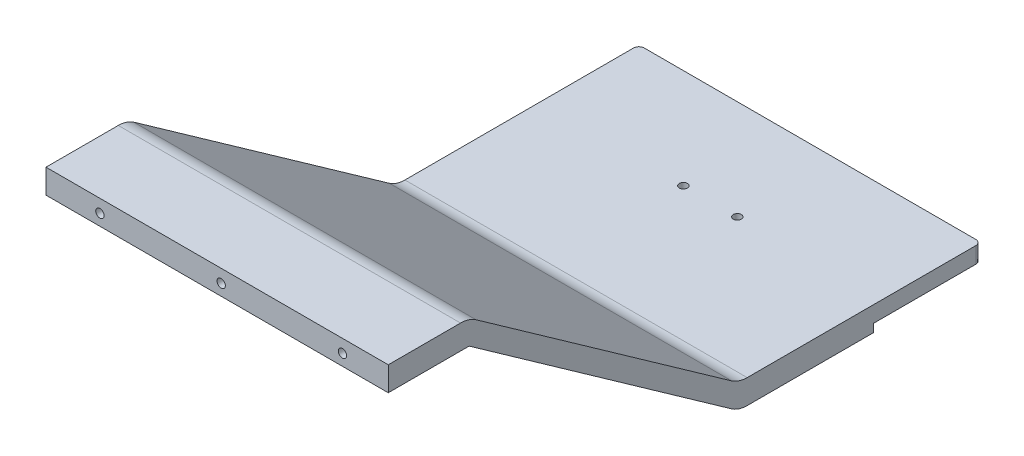
ISO-10303-21;
HEADER;
FILE_DESCRIPTION(('STEP AP214'),'2;1');
FILE_NAME('part.step','',(''),(''),'','','');
FILE_SCHEMA(('AUTOMOTIVE_DESIGN { 1 0 10303 214 1 1 1 1 }'));
ENDSEC;
DATA;
#1=APPLICATION_CONTEXT('core data for automotive mechanical design processes');
#2=APPLICATION_PROTOCOL_DEFINITION('international standard','automotive_design',2000,#1);
#3=PRODUCT_CONTEXT('',#1,'mechanical');
#4=PRODUCT('Part','Part','',(#3));
#5=PRODUCT_RELATED_PRODUCT_CATEGORY('part','',(#4));
#6=PRODUCT_DEFINITION_FORMATION('','',#4);
#7=PRODUCT_DEFINITION_CONTEXT('part definition',#1,'design');
#8=PRODUCT_DEFINITION('design','',#6,#7);
#9=PRODUCT_DEFINITION_SHAPE('','',#8);
#10=(LENGTH_UNIT() NAMED_UNIT(*) SI_UNIT(.MILLI.,.METRE.));
#11=(NAMED_UNIT(*) PLANE_ANGLE_UNIT() SI_UNIT($,.RADIAN.));
#12=(NAMED_UNIT(*) SI_UNIT($,.STERADIAN.) SOLID_ANGLE_UNIT());
#13=UNCERTAINTY_MEASURE_WITH_UNIT(LENGTH_MEASURE(1.E-05),#10,'distance_accuracy_value','');
#14=(GEOMETRIC_REPRESENTATION_CONTEXT(3) GLOBAL_UNCERTAINTY_ASSIGNED_CONTEXT((#13)) GLOBAL_UNIT_ASSIGNED_CONTEXT((#10,
#11,#12)) REPRESENTATION_CONTEXT('',''));
#15=CARTESIAN_POINT('',(0.,0.,0.));
#16=DIRECTION('',(0.,0.,1.));
#17=DIRECTION('',(1.,0.,0.));
#18=AXIS2_PLACEMENT_3D('',#15,#16,#17);
#19=CARTESIAN_POINT('',(206.,70.,-50.));
#20=DIRECTION('',(0.,0.,1.));
#21=DIRECTION('',(1.,0.,0.));
#22=AXIS2_PLACEMENT_3D('',#19,#20,#21);
#23=PLANE('',#22);
#24=DIRECTION('',(0.,1.,0.));
#25=VECTOR('',#24,1.);
#26=CARTESIAN_POINT('',(79.,70.,-50.));
#27=LINE('',#26,#25);
#28=CARTESIAN_POINT('',(79.,70.,-50.));
#29=VERTEX_POINT('',#28);
#30=CARTESIAN_POINT('',(79.,73.,-50.));
#31=VERTEX_POINT('',#30);
#32=EDGE_CURVE('E190',#29,#31,#27,.T.);
#33=ORIENTED_EDGE('',*,*,#32,.T.);
#34=DIRECTION('',(-1.,0.,0.));
#35=VECTOR('',#34,1.);
#36=CARTESIAN_POINT('',(206.,73.,-50.));
#37=LINE('',#36,#35);
#38=CARTESIAN_POINT('',(206.,73.,-50.));
#39=VERTEX_POINT('',#38);
#40=EDGE_CURVE('E252',#39,#31,#37,.T.);
#41=ORIENTED_EDGE('',*,*,#40,.F.);
#42=DIRECTION('',(0.,1.,0.));
#43=VECTOR('',#42,1.);
#44=CARTESIAN_POINT('',(206.,70.,-50.));
#45=LINE('',#44,#43);
#46=CARTESIAN_POINT('',(206.,70.,-50.));
#47=VERTEX_POINT('',#46);
#48=EDGE_CURVE('E197',#47,#39,#45,.T.);
#49=ORIENTED_EDGE('',*,*,#48,.F.);
#50=DIRECTION('',(-1.,0.,0.));
#51=VECTOR('',#50,1.);
#52=CARTESIAN_POINT('',(206.,70.,-50.));
#53=LINE('',#52,#51);
#54=EDGE_CURVE('E211',#47,#29,#53,.T.);
#55=ORIENTED_EDGE('',*,*,#54,.T.);
#56=EDGE_LOOP('',(#33,#41,#49,#55));
#57=FACE_BOUND('',#56,.T.);
#58=ADVANCED_FACE('F57',(#57),#23,.F.);
#59=CARTESIAN_POINT('',(206.,73.,-50.));
#60=DIRECTION('',(0.,1.,0.));
#61=DIRECTION('',(0.,0.,1.));
#62=AXIS2_PLACEMENT_3D('',#59,#60,#61);
#63=PLANE('',#62);
#64=CARTESIAN_POINT('',(132.5,73.,-53.));
#65=DIRECTION('',(0.,-1.,0.));
#66=DIRECTION('',(0.,0.,-1.));
#67=AXIS2_PLACEMENT_3D('',#64,#65,#66);
#68=CIRCLE('',#67,1.5);
#69=CARTESIAN_POINT('',(132.5,73.,-54.5));
#70=VERTEX_POINT('',#69);
#71=EDGE_CURVE('E277',#70,#70,#68,.T.);
#72=ORIENTED_EDGE('',*,*,#71,.F.);
#73=EDGE_LOOP('',(#72));
#74=FACE_BOUND('',#73,.T.);
#75=CARTESIAN_POINT('',(152.5,73.,-53.));
#76=DIRECTION('',(0.,-1.,0.));
#77=DIRECTION('',(0.,0.,-1.));
#78=AXIS2_PLACEMENT_3D('',#75,#76,#77);
#79=CIRCLE('',#78,1.5);
#80=CARTESIAN_POINT('',(152.5,73.,-54.5));
#81=VERTEX_POINT('',#80);
#82=EDGE_CURVE('E557',#81,#81,#79,.T.);
#83=ORIENTED_EDGE('',*,*,#82,.F.);
#84=EDGE_LOOP('',(#83));
#85=FACE_BOUND('',#84,.T.);
#86=DIRECTION('',(-1.,0.,0.));
#87=VECTOR('',#86,1.);
#88=CARTESIAN_POINT('',(206.,73.,-90.));
#89=LINE('',#88,#87);
#90=CARTESIAN_POINT('',(204.,73.,-90.));
#91=VERTEX_POINT('',#90);
#92=CARTESIAN_POINT('',(81.,73.,-90.));
#93=VERTEX_POINT('',#92);
#94=EDGE_CURVE('E247',#91,#93,#89,.T.);
#95=ORIENTED_EDGE('',*,*,#94,.F.);
#96=CARTESIAN_POINT('',(204.,73.,-88.));
#97=DIRECTION('',(0.,1.,0.));
#98=DIRECTION('',(0.,0.,1.));
#99=AXIS2_PLACEMENT_3D('',#96,#97,#98);
#100=CIRCLE('',#99,2.);
#101=CARTESIAN_POINT('',(206.,73.,-88.));
#102=VERTEX_POINT('',#101);
#103=EDGE_CURVE('E270',#91,#102,#100,.F.);
#104=ORIENTED_EDGE('',*,*,#103,.T.);
#105=DIRECTION('',(0.,0.,-1.));
#106=VECTOR('',#105,1.);
#107=CARTESIAN_POINT('',(206.,73.,-50.));
#108=LINE('',#107,#106);
#109=EDGE_CURVE('E199',#39,#102,#108,.T.);
#110=ORIENTED_EDGE('',*,*,#109,.F.);
#111=ORIENTED_EDGE('',*,*,#40,.T.);
#112=DIRECTION('',(0.,0.,-1.));
#113=VECTOR('',#112,1.);
#114=CARTESIAN_POINT('',(79.,73.,-50.));
#115=LINE('',#114,#113);
#116=CARTESIAN_POINT('',(79.,73.,-88.));
#117=VERTEX_POINT('',#116);
#118=EDGE_CURVE('E188',#31,#117,#115,.T.);
#119=ORIENTED_EDGE('',*,*,#118,.T.);
#120=CARTESIAN_POINT('',(81.,73.,-88.));
#121=DIRECTION('',(0.,1.,0.));
#122=DIRECTION('',(0.,0.,1.));
#123=AXIS2_PLACEMENT_3D('',#120,#121,#122);
#124=CIRCLE('',#123,2.);
#125=EDGE_CURVE('E269',#117,#93,#124,.F.);
#126=ORIENTED_EDGE('',*,*,#125,.T.);
#127=EDGE_LOOP('',(#95,#104,#110,#111,#119,#126));
#128=FACE_BOUND('',#127,.T.);
#129=ADVANCED_FACE('F325',(#74,#85,#128),#63,.F.);
#130=CARTESIAN_POINT('',(206.,73.,-90.));
#131=DIRECTION('',(0.,0.,1.));
#132=DIRECTION('',(1.,0.,0.));
#133=AXIS2_PLACEMENT_3D('',#130,#131,#132);
#134=PLANE('',#133);
#135=DIRECTION('',(-1.,0.,0.));
#136=VECTOR('',#135,1.);
#137=CARTESIAN_POINT('',(206.,79.,-90.));
#138=LINE('',#137,#136);
#139=CARTESIAN_POINT('',(204.,79.,-90.));
#140=VERTEX_POINT('',#139);
#141=CARTESIAN_POINT('',(81.,79.,-90.));
#142=VERTEX_POINT('',#141);
#143=EDGE_CURVE('E244',#140,#142,#138,.T.);
#144=ORIENTED_EDGE('',*,*,#143,.F.);
#145=DIRECTION('',(0.,1.,0.));
#146=VECTOR('',#145,1.);
#147=CARTESIAN_POINT('',(204.,73.,-90.));
#148=LINE('',#147,#146);
#149=EDGE_CURVE('E264',#140,#91,#148,.F.);
#150=ORIENTED_EDGE('',*,*,#149,.T.);
#151=ORIENTED_EDGE('',*,*,#94,.T.);
#152=DIRECTION('',(0.,1.,0.));
#153=VECTOR('',#152,1.);
#154=CARTESIAN_POINT('',(81.,73.,-90.));
#155=LINE('',#154,#153);
#156=EDGE_CURVE('E262',#93,#142,#155,.T.);
#157=ORIENTED_EDGE('',*,*,#156,.T.);
#158=EDGE_LOOP('',(#144,#150,#151,#157));
#159=FACE_BOUND('',#158,.T.);
#160=ADVANCED_FACE('F357',(#159),#134,.F.);
#161=CARTESIAN_POINT('',(206.,79.,-90.));
#162=DIRECTION('',(0.,-1.,0.));
#163=DIRECTION('',(0.,0.,-1.));
#164=AXIS2_PLACEMENT_3D('',#161,#162,#163);
#165=PLANE('',#164);
#166=CARTESIAN_POINT('',(132.5,79.,-53.));
#167=DIRECTION('',(0.,-1.,0.));
#168=DIRECTION('',(0.,0.,-1.));
#169=AXIS2_PLACEMENT_3D('',#166,#167,#168);
#170=CIRCLE('',#169,1.5);
#171=CARTESIAN_POINT('',(132.5,79.,-54.5));
#172=VERTEX_POINT('',#171);
#173=EDGE_CURVE('E273',#172,#172,#170,.T.);
#174=ORIENTED_EDGE('',*,*,#173,.T.);
#175=EDGE_LOOP('',(#174));
#176=FACE_BOUND('',#175,.T.);
#177=CARTESIAN_POINT('',(152.5,79.,-53.));
#178=DIRECTION('',(0.,-1.,0.));
#179=DIRECTION('',(0.,0.,-1.));
#180=AXIS2_PLACEMENT_3D('',#177,#178,#179);
#181=CIRCLE('',#180,1.5);
#182=CARTESIAN_POINT('',(152.5,79.,-54.5));
#183=VERTEX_POINT('',#182);
#184=EDGE_CURVE('E275',#183,#183,#181,.T.);
#185=ORIENTED_EDGE('',*,*,#184,.T.);
#186=EDGE_LOOP('',(#185));
#187=FACE_BOUND('',#186,.T.);
#188=DIRECTION('',(0.,0.,1.));
#189=VECTOR('',#188,1.);
#190=CARTESIAN_POINT('',(206.,79.,-90.));
#191=LINE('',#190,#189);
#192=CARTESIAN_POINT('',(206.,79.,-88.));
#193=VERTEX_POINT('',#192);
#194=CARTESIAN_POINT('',(206.,79.,-3.17837245195783));
#195=VERTEX_POINT('',#194);
#196=EDGE_CURVE('E205',#193,#195,#191,.T.);
#197=ORIENTED_EDGE('',*,*,#196,.F.);
#198=CARTESIAN_POINT('',(204.,79.,-88.));
#199=DIRECTION('',(0.,-1.,0.));
#200=DIRECTION('',(0.,0.,-1.));
#201=AXIS2_PLACEMENT_3D('',#198,#199,#200);
#202=CIRCLE('',#201,2.);
#203=EDGE_CURVE('E256',#193,#140,#202,.F.);
#204=ORIENTED_EDGE('',*,*,#203,.T.);
#205=ORIENTED_EDGE('',*,*,#143,.T.);
#206=CARTESIAN_POINT('',(81.,79.,-88.));
#207=DIRECTION('',(0.,-1.,0.));
#208=DIRECTION('',(0.,0.,-1.));
#209=AXIS2_PLACEMENT_3D('',#206,#207,#208);
#210=CIRCLE('',#209,2.);
#211=CARTESIAN_POINT('',(79.,79.,-88.));
#212=VERTEX_POINT('',#211);
#213=EDGE_CURVE('E259',#142,#212,#210,.F.);
#214=ORIENTED_EDGE('',*,*,#213,.T.);
#215=DIRECTION('',(0.,0.,1.));
#216=VECTOR('',#215,1.);
#217=CARTESIAN_POINT('',(79.,79.,-90.));
#218=LINE('',#217,#216);
#219=CARTESIAN_POINT('',(79.,79.,-3.17837245195783));
#220=VERTEX_POINT('',#219);
#221=EDGE_CURVE('E218',#212,#220,#218,.T.);
#222=ORIENTED_EDGE('',*,*,#221,.T.);
#223=DIRECTION('',(-1.,0.,0.));
#224=VECTOR('',#223,1.);
#225=CARTESIAN_POINT('',(206.,79.,-3.17837245195783));
#226=LINE('',#225,#224);
#227=EDGE_CURVE('E245',#195,#220,#226,.T.);
#228=ORIENTED_EDGE('',*,*,#227,.F.);
#229=EDGE_LOOP('',(#197,#204,#205,#214,#222,#228));
#230=FACE_BOUND('',#229,.T.);
#231=ADVANCED_FACE('F331',(#176,#187,#230),#165,.F.);
#232=CARTESIAN_POINT('',(206.,89.,-3.17837245195783));
#233=DIRECTION('',(-1.,0.,0.));
#234=DIRECTION('',(0.,0.,1.));
#235=AXIS2_PLACEMENT_3D('',#232,#233,#234);
#236=CYLINDRICAL_SURFACE('',#235,10.);
#237=CARTESIAN_POINT('',(79.,89.,-3.17837245195783));
#238=DIRECTION('',(-1.,0.,0.));
#239=DIRECTION('',(0.,0.,-1.));
#240=AXIS2_PLACEMENT_3D('',#237,#238,#239);
#241=CIRCLE('',#240,10.);
#242=CARTESIAN_POINT('',(79.,80.8350341907227,2.59513023993843));
#243=VERTEX_POINT('',#242);
#244=EDGE_CURVE('E216',#220,#243,#241,.T.);
#245=ORIENTED_EDGE('',*,*,#244,.T.);
#246=DIRECTION('',(-1.,0.,0.));
#247=VECTOR('',#246,1.);
#248=CARTESIAN_POINT('',(206.,80.8350341907227,2.59513023993843));
#249=LINE('',#248,#247);
#250=CARTESIAN_POINT('',(206.,80.8350341907227,2.59513023993843));
#251=VERTEX_POINT('',#250);
#252=EDGE_CURVE('E237',#251,#243,#249,.T.);
#253=ORIENTED_EDGE('',*,*,#252,.F.);
#254=CARTESIAN_POINT('',(206.,89.,-3.17837245195783));
#255=DIRECTION('',(-1.,0.,0.));
#256=DIRECTION('',(0.,0.,-1.));
#257=AXIS2_PLACEMENT_3D('',#254,#255,#256);
#258=CIRCLE('',#257,10.);
#259=EDGE_CURVE('E202',#195,#251,#258,.T.);
#260=ORIENTED_EDGE('',*,*,#259,.F.);
#261=ORIENTED_EDGE('',*,*,#227,.T.);
#262=EDGE_LOOP('',(#245,#253,#260,#261));
#263=FACE_BOUND('',#262,.T.);
#264=ADVANCED_FACE('F339',(#263),#236,.F.);
#265=CARTESIAN_POINT('',(206.,80.8350341907227,2.59513023993843));
#266=DIRECTION('',(0.,-0.816496580927727,0.577350269189625));
#267=DIRECTION('',(0.,-0.577350269189625,-0.816496580927727));
#268=AXIS2_PLACEMENT_3D('',#265,#266,#267);
#269=PLANE('',#268);
#270=DIRECTION('',(0.,0.577350269189625,0.816496580927726));
#271=VECTOR('',#270,1.);
#272=CARTESIAN_POINT('',(79.,80.8350341907227,2.59513023993843));
#273=LINE('',#272,#271);
#274=CARTESIAN_POINT('',(79.,147.875643927932,97.4048697600616));
#275=VERTEX_POINT('',#274);
#276=EDGE_CURVE('E221',#243,#275,#273,.T.);
#277=ORIENTED_EDGE('',*,*,#276,.T.);
#278=DIRECTION('',(-1.,0.,0.));
#279=VECTOR('',#278,1.);
#280=CARTESIAN_POINT('',(206.,147.875643927932,97.4048697600616));
#281=LINE('',#280,#279);
#282=CARTESIAN_POINT('',(206.,147.875643927932,97.4048697600616));
#283=VERTEX_POINT('',#282);
#284=EDGE_CURVE('E61',#275,#283,#281,.F.);
#285=ORIENTED_EDGE('',*,*,#284,.T.);
#286=DIRECTION('',(0.,0.577350269189625,0.816496580927726));
#287=VECTOR('',#286,1.);
#288=CARTESIAN_POINT('',(206.,80.8350341907227,2.59513023993843));
#289=LINE('',#288,#287);
#290=EDGE_CURVE('E210',#251,#283,#289,.T.);
#291=ORIENTED_EDGE('',*,*,#290,.F.);
#292=ORIENTED_EDGE('',*,*,#252,.T.);
#293=EDGE_LOOP('',(#277,#285,#291,#292));
#294=FACE_BOUND('',#293,.T.);
#295=ADVANCED_FACE('F374',(#294),#269,.F.);
#296=CARTESIAN_POINT('',(206.,140.710678118655,100.));
#297=DIRECTION('',(0.,0.816496580927726,-0.577350269189625));
#298=DIRECTION('',(0.,0.577350269189625,0.816496580927727));
#299=AXIS2_PLACEMENT_3D('',#296,#297,#298);
#300=PLANE('',#299);
#301=DIRECTION('',(0.,-0.577350269189625,-0.816496580927727));
#302=VECTOR('',#301,1.);
#303=CARTESIAN_POINT('',(79.,140.710678118655,100.));
#304=LINE('',#303,#302);
#305=CARTESIAN_POINT('',(79.,140.710678118655,100.));
#306=VERTEX_POINT('',#305);
#307=CARTESIAN_POINT('',(79.,71.8350341907228,2.59513023993842));
#308=VERTEX_POINT('',#307);
#309=EDGE_CURVE('E223',#306,#308,#304,.T.);
#310=ORIENTED_EDGE('',*,*,#309,.T.);
#311=DIRECTION('',(-1.,0.,0.));
#312=VECTOR('',#311,1.);
#313=CARTESIAN_POINT('',(206.,71.8350341907228,2.59513023993842));
#314=LINE('',#313,#312);
#315=CARTESIAN_POINT('',(206.,71.8350341907228,2.59513023993842));
#316=VERTEX_POINT('',#315);
#317=EDGE_CURVE('E234',#316,#308,#314,.T.);
#318=ORIENTED_EDGE('',*,*,#317,.F.);
#319=DIRECTION('',(0.,-0.577350269189625,-0.816496580927727));
#320=VECTOR('',#319,1.);
#321=CARTESIAN_POINT('',(206.,140.710678118655,100.));
#322=LINE('',#321,#320);
#323=CARTESIAN_POINT('',(206.,140.710678118655,100.));
#324=VERTEX_POINT('',#323);
#325=EDGE_CURVE('E209',#324,#316,#322,.T.);
#326=ORIENTED_EDGE('',*,*,#325,.F.);
#327=DIRECTION('',(-1.,0.,0.));
#328=VECTOR('',#327,1.);
#329=CARTESIAN_POINT('',(206.,140.710678118655,100.));
#330=LINE('',#329,#328);
#331=EDGE_CURVE('E240',#324,#306,#330,.T.);
#332=ORIENTED_EDGE('',*,*,#331,.T.);
#333=EDGE_LOOP('',(#310,#318,#326,#332));
#334=FACE_BOUND('',#333,.T.);
#335=ADVANCED_FACE('F304',(#334),#300,.F.);
#336=CARTESIAN_POINT('',(206.,80.,-3.17837245195782));
#337=DIRECTION('',(-1.,0.,0.));
#338=DIRECTION('',(0.,0.,1.));
#339=AXIS2_PLACEMENT_3D('',#336,#337,#338);
#340=CYLINDRICAL_SURFACE('',#339,9.99999999999999);
#341=CARTESIAN_POINT('',(79.,80.,-3.17837245195782));
#342=DIRECTION('',(1.,0.,0.));
#343=DIRECTION('',(0.,0.,-1.));
#344=AXIS2_PLACEMENT_3D('',#341,#342,#343);
#345=CIRCLE('',#344,9.99999999999999);
#346=CARTESIAN_POINT('',(79.,70.,-3.17837245195782));
#347=VERTEX_POINT('',#346);
#348=EDGE_CURVE('E228',#308,#347,#345,.T.);
#349=ORIENTED_EDGE('',*,*,#348,.T.);
#350=DIRECTION('',(-1.,0.,0.));
#351=VECTOR('',#350,1.);
#352=CARTESIAN_POINT('',(206.,70.,-3.17837245195782));
#353=LINE('',#352,#351);
#354=CARTESIAN_POINT('',(206.,70.,-3.17837245195782));
#355=VERTEX_POINT('',#354);
#356=EDGE_CURVE('E233',#355,#347,#353,.T.);
#357=ORIENTED_EDGE('',*,*,#356,.F.);
#358=CARTESIAN_POINT('',(206.,80.,-3.17837245195782));
#359=DIRECTION('',(1.,0.,0.));
#360=DIRECTION('',(0.,0.,-1.));
#361=AXIS2_PLACEMENT_3D('',#358,#359,#360);
#362=CIRCLE('',#361,9.99999999999999);
#363=EDGE_CURVE('E212',#316,#355,#362,.T.);
#364=ORIENTED_EDGE('',*,*,#363,.F.);
#365=ORIENTED_EDGE('',*,*,#317,.T.);
#366=EDGE_LOOP('',(#349,#357,#364,#365));
#367=FACE_BOUND('',#366,.T.);
#368=ADVANCED_FACE('F311',(#367),#340,.T.);
#369=CARTESIAN_POINT('',(206.,70.,-3.17837245195782));
#370=DIRECTION('',(0.,1.,0.));
#371=DIRECTION('',(0.,0.,1.));
#372=AXIS2_PLACEMENT_3D('',#369,#370,#371);
#373=PLANE('',#372);
#374=DIRECTION('',(0.,0.,-1.));
#375=VECTOR('',#374,1.);
#376=CARTESIAN_POINT('',(79.,70.,-3.17837245195782));
#377=LINE('',#376,#375);
#378=EDGE_CURVE('E196',#347,#29,#377,.T.);
#379=ORIENTED_EDGE('',*,*,#378,.T.);
#380=ORIENTED_EDGE('',*,*,#54,.F.);
#381=DIRECTION('',(0.,0.,-1.));
#382=VECTOR('',#381,1.);
#383=CARTESIAN_POINT('',(206.,70.,-3.17837245195782));
#384=LINE('',#383,#382);
#385=EDGE_CURVE('E215',#355,#47,#384,.T.);
#386=ORIENTED_EDGE('',*,*,#385,.F.);
#387=ORIENTED_EDGE('',*,*,#356,.T.);
#388=EDGE_LOOP('',(#379,#380,#386,#387));
#389=FACE_BOUND('',#388,.T.);
#390=ADVANCED_FACE('F314',(#389),#373,.F.);
#391=CARTESIAN_POINT('',(206.,89.,-3.17837245195783));
#392=DIRECTION('',(1.,0.,0.));
#393=DIRECTION('',(0.,0.,-1.));
#394=AXIS2_PLACEMENT_3D('',#391,#392,#393);
#395=PLANE('',#394);
#396=ORIENTED_EDGE('',*,*,#290,.T.);
#397=CARTESIAN_POINT('',(206.,139.710678118655,103.178372451958));
#398=DIRECTION('',(1.,0.,0.));
#399=DIRECTION('',(0.,0.,-1.));
#400=AXIS2_PLACEMENT_3D('',#397,#398,#399);
#401=CIRCLE('',#400,10.);
#402=CARTESIAN_POINT('',(206.,149.710678118655,103.178372451958));
#403=VERTEX_POINT('',#402);
#404=EDGE_CURVE('E12',#283,#403,#401,.T.);
#405=ORIENTED_EDGE('',*,*,#404,.T.);
#406=DIRECTION('',(0.,0.,-1.));
#407=VECTOR('',#406,1.);
#408=CARTESIAN_POINT('',(206.,149.710678118655,130.));
#409=LINE('',#408,#407);
#410=CARTESIAN_POINT('',(206.,149.710678118655,130.));
#411=VERTEX_POINT('',#410);
#412=EDGE_CURVE('E294',#411,#403,#409,.T.);
#413=ORIENTED_EDGE('',*,*,#412,.F.);
#414=DIRECTION('',(0.,1.,0.));
#415=VECTOR('',#414,1.);
#416=CARTESIAN_POINT('',(206.,140.710678118655,130.));
#417=LINE('',#416,#415);
#418=CARTESIAN_POINT('',(206.,140.710678118655,130.));
#419=VERTEX_POINT('',#418);
#420=EDGE_CURVE('E180',#419,#411,#417,.T.);
#421=ORIENTED_EDGE('',*,*,#420,.F.);
#422=DIRECTION('',(0.,0.,-1.));
#423=VECTOR('',#422,1.);
#424=CARTESIAN_POINT('',(206.,140.710678118655,130.));
#425=LINE('',#424,#423);
#426=EDGE_CURVE('E194',#419,#324,#425,.T.);
#427=ORIENTED_EDGE('',*,*,#426,.T.);
#428=ORIENTED_EDGE('',*,*,#325,.T.);
#429=ORIENTED_EDGE('',*,*,#363,.T.);
#430=ORIENTED_EDGE('',*,*,#385,.T.);
#431=ORIENTED_EDGE('',*,*,#48,.T.);
#432=ORIENTED_EDGE('',*,*,#109,.T.);
#433=DIRECTION('',(0.,1.,0.));
#434=VECTOR('',#433,1.);
#435=CARTESIAN_POINT('',(206.,79.,-88.));
#436=LINE('',#435,#434);
#437=EDGE_CURVE('E251',#102,#193,#436,.T.);
#438=ORIENTED_EDGE('',*,*,#437,.T.);
#439=ORIENTED_EDGE('',*,*,#196,.T.);
#440=ORIENTED_EDGE('',*,*,#259,.T.);
#441=EDGE_LOOP('',(#396,#405,#413,#421,#427,#428,#429,#430,#431,#432,#438,#439,#440));
#442=FACE_BOUND('',#441,.T.);
#443=ADVANCED_FACE('F299',(#442),#395,.T.);
#444=CARTESIAN_POINT('',(79.,89.,-3.17837245195783));
#445=DIRECTION('',(1.,0.,0.));
#446=DIRECTION('',(0.,0.,-1.));
#447=AXIS2_PLACEMENT_3D('',#444,#445,#446);
#448=PLANE('',#447);
#449=DIRECTION('',(0.,0.,-1.));
#450=VECTOR('',#449,1.);
#451=CARTESIAN_POINT('',(79.,149.710678118655,130.));
#452=LINE('',#451,#450);
#453=CARTESIAN_POINT('',(79.,149.710678118655,130.));
#454=VERTEX_POINT('',#453);
#455=CARTESIAN_POINT('',(79.,149.710678118655,103.178372451958));
#456=VERTEX_POINT('',#455);
#457=EDGE_CURVE('E164',#454,#456,#452,.T.);
#458=ORIENTED_EDGE('',*,*,#457,.T.);
#459=CARTESIAN_POINT('',(79.,139.710678118655,103.178372451958));
#460=DIRECTION('',(1.,0.,0.));
#461=DIRECTION('',(0.,0.,-1.));
#462=AXIS2_PLACEMENT_3D('',#459,#460,#461);
#463=CIRCLE('',#462,10.);
#464=EDGE_CURVE('E76',#456,#275,#463,.F.);
#465=ORIENTED_EDGE('',*,*,#464,.T.);
#466=ORIENTED_EDGE('',*,*,#276,.F.);
#467=ORIENTED_EDGE('',*,*,#244,.F.);
#468=ORIENTED_EDGE('',*,*,#221,.F.);
#469=DIRECTION('',(0.,1.,0.));
#470=VECTOR('',#469,1.);
#471=CARTESIAN_POINT('',(79.,89.,-88.));
#472=LINE('',#471,#470);
#473=EDGE_CURVE('E267',#212,#117,#472,.F.);
#474=ORIENTED_EDGE('',*,*,#473,.T.);
#475=ORIENTED_EDGE('',*,*,#118,.F.);
#476=ORIENTED_EDGE('',*,*,#32,.F.);
#477=ORIENTED_EDGE('',*,*,#378,.F.);
#478=ORIENTED_EDGE('',*,*,#348,.F.);
#479=ORIENTED_EDGE('',*,*,#309,.F.);
#480=DIRECTION('',(0.,0.,-1.));
#481=VECTOR('',#480,1.);
#482=CARTESIAN_POINT('',(79.,140.710678118655,130.));
#483=LINE('',#482,#481);
#484=CARTESIAN_POINT('',(79.,140.710678118655,130.));
#485=VERTEX_POINT('',#484);
#486=EDGE_CURVE('E166',#485,#306,#483,.T.);
#487=ORIENTED_EDGE('',*,*,#486,.F.);
#488=DIRECTION('',(0.,-1.,0.));
#489=VECTOR('',#488,1.);
#490=CARTESIAN_POINT('',(79.,149.710678118655,130.));
#491=LINE('',#490,#489);
#492=EDGE_CURVE('E163',#454,#485,#491,.T.);
#493=ORIENTED_EDGE('',*,*,#492,.F.);
#494=EDGE_LOOP('',(#458,#465,#466,#467,#468,#474,#475,#476,#477,#478,#479,#487,#493));
#495=FACE_BOUND('',#494,.T.);
#496=ADVANCED_FACE('F161',(#495),#448,.F.);
#497=CARTESIAN_POINT('',(206.,149.710678118655,130.));
#498=DIRECTION('',(0.,-1.,0.));
#499=DIRECTION('',(0.,0.,-1.));
#500=AXIS2_PLACEMENT_3D('',#497,#498,#499);
#501=PLANE('',#500);
#502=ORIENTED_EDGE('',*,*,#412,.T.);
#503=DIRECTION('',(-1.,0.,0.));
#504=VECTOR('',#503,1.);
#505=CARTESIAN_POINT('',(206.,149.710678118655,103.178372451958));
#506=LINE('',#505,#504);
#507=EDGE_CURVE('E187',#403,#456,#506,.T.);
#508=ORIENTED_EDGE('',*,*,#507,.T.);
#509=ORIENTED_EDGE('',*,*,#457,.F.);
#510=DIRECTION('',(-1.,0.,0.));
#511=VECTOR('',#510,1.);
#512=CARTESIAN_POINT('',(206.,149.710678118655,130.));
#513=LINE('',#512,#511);
#514=EDGE_CURVE('E175',#411,#454,#513,.T.);
#515=ORIENTED_EDGE('',*,*,#514,.F.);
#516=EDGE_LOOP('',(#502,#508,#509,#515));
#517=FACE_BOUND('',#516,.T.);
#518=ADVANCED_FACE('F183',(#517),#501,.F.);
#519=CARTESIAN_POINT('',(79.,140.710678118655,130.));
#520=DIRECTION('',(0.,1.,0.));
#521=DIRECTION('',(0.,0.,1.));
#522=AXIS2_PLACEMENT_3D('',#519,#520,#521);
#523=PLANE('',#522);
#524=ORIENTED_EDGE('',*,*,#331,.F.);
#525=ORIENTED_EDGE('',*,*,#426,.F.);
#526=DIRECTION('',(1.,0.,0.));
#527=VECTOR('',#526,1.);
#528=CARTESIAN_POINT('',(79.,140.710678118655,130.));
#529=LINE('',#528,#527);
#530=EDGE_CURVE('E171',#485,#419,#529,.T.);
#531=ORIENTED_EDGE('',*,*,#530,.F.);
#532=ORIENTED_EDGE('',*,*,#486,.T.);
#533=EDGE_LOOP('',(#524,#525,#531,#532));
#534=FACE_BOUND('',#533,.T.);
#535=ADVANCED_FACE('F303',(#534),#523,.F.);
#536=CARTESIAN_POINT('',(0.,0.,130.));
#537=DIRECTION('',(0.,0.,1.));
#538=DIRECTION('',(1.,0.,0.));
#539=AXIS2_PLACEMENT_3D('',#536,#537,#538);
#540=PLANE('',#539);
#541=CARTESIAN_POINT('',(99.,144.890678118655,130.));
#542=DIRECTION('',(0.,0.,1.));
#543=DIRECTION('',(1.,0.,0.));
#544=AXIS2_PLACEMENT_3D('',#541,#542,#543);
#545=CIRCLE('',#544,1.54999999999999);
#546=CARTESIAN_POINT('',(100.55,144.890678118655,130.));
#547=VERTEX_POINT('',#546);
#548=EDGE_CURVE('E555',#547,#547,#545,.T.);
#549=ORIENTED_EDGE('',*,*,#548,.F.);
#550=EDGE_LOOP('',(#549));
#551=FACE_BOUND('',#550,.T.);
#552=CARTESIAN_POINT('',(144.,144.890678118655,130.));
#553=DIRECTION('',(0.,0.,1.));
#554=DIRECTION('',(1.,0.,0.));
#555=AXIS2_PLACEMENT_3D('',#552,#553,#554);
#556=CIRCLE('',#555,1.54999999999999);
#557=CARTESIAN_POINT('',(145.55,144.890678118655,130.));
#558=VERTEX_POINT('',#557);
#559=EDGE_CURVE('E560',#558,#558,#556,.T.);
#560=ORIENTED_EDGE('',*,*,#559,.F.);
#561=EDGE_LOOP('',(#560));
#562=FACE_BOUND('',#561,.T.);
#563=CARTESIAN_POINT('',(189.,144.890678118655,130.));
#564=DIRECTION('',(0.,0.,1.));
#565=DIRECTION('',(1.,0.,0.));
#566=AXIS2_PLACEMENT_3D('',#563,#564,#565);
#567=CIRCLE('',#566,1.54999999999999);
#568=CARTESIAN_POINT('',(190.55,144.890678118655,130.));
#569=VERTEX_POINT('',#568);
#570=EDGE_CURVE('E284',#569,#569,#567,.T.);
#571=ORIENTED_EDGE('',*,*,#570,.F.);
#572=EDGE_LOOP('',(#571));
#573=FACE_BOUND('',#572,.T.);
#574=ORIENTED_EDGE('',*,*,#514,.T.);
#575=ORIENTED_EDGE('',*,*,#492,.T.);
#576=ORIENTED_EDGE('',*,*,#530,.T.);
#577=ORIENTED_EDGE('',*,*,#420,.T.);
#578=EDGE_LOOP('',(#574,#575,#576,#577));
#579=FACE_BOUND('',#578,.T.);
#580=ADVANCED_FACE('F174',(#551,#562,#573,#579),#540,.T.);
#581=CARTESIAN_POINT('',(189.,144.890678118655,125.));
#582=DIRECTION('',(0.,0.,1.));
#583=DIRECTION('',(1.,0.,0.));
#584=AXIS2_PLACEMENT_3D('',#581,#582,#583);
#585=CYLINDRICAL_SURFACE('',#584,1.54999999999999);
#586=CARTESIAN_POINT('',(189.,144.890678118655,125.));
#587=DIRECTION('',(0.,0.,1.));
#588=DIRECTION('',(1.,0.,0.));
#589=AXIS2_PLACEMENT_3D('',#586,#587,#588);
#590=CIRCLE('',#589,1.54999999999999);
#591=CARTESIAN_POINT('',(190.55,144.890678118655,125.));
#592=VERTEX_POINT('',#591);
#593=EDGE_CURVE('E276',#592,#592,#590,.T.);
#594=ORIENTED_EDGE('',*,*,#593,.F.);
#595=EDGE_LOOP('',(#594));
#596=FACE_BOUND('',#595,.T.);
#597=ORIENTED_EDGE('',*,*,#570,.T.);
#598=EDGE_LOOP('',(#597));
#599=FACE_BOUND('',#598,.T.);
#600=ADVANCED_FACE('F502',(#596,#599),#585,.F.);
#601=CARTESIAN_POINT('',(189.,144.890678118655,125.));
#602=DIRECTION('',(0.,0.,1.));
#603=DIRECTION('',(1.,0.,0.));
#604=AXIS2_PLACEMENT_3D('',#601,#602,#603);
#605=PLANE('',#604);
#606=ORIENTED_EDGE('',*,*,#593,.T.);
#607=EDGE_LOOP('',(#606));
#608=FACE_BOUND('',#607,.T.);
#609=ADVANCED_FACE('F514',(#608),#605,.T.);
#610=CARTESIAN_POINT('',(144.,144.890678118655,125.));
#611=DIRECTION('',(0.,0.,1.));
#612=DIRECTION('',(1.,0.,0.));
#613=AXIS2_PLACEMENT_3D('',#610,#611,#612);
#614=CYLINDRICAL_SURFACE('',#613,1.54999999999999);
#615=CARTESIAN_POINT('',(144.,144.890678118655,125.));
#616=DIRECTION('',(0.,0.,1.));
#617=DIRECTION('',(1.,0.,0.));
#618=AXIS2_PLACEMENT_3D('',#615,#616,#617);
#619=CIRCLE('',#618,1.54999999999999);
#620=CARTESIAN_POINT('',(145.55,144.890678118655,125.));
#621=VERTEX_POINT('',#620);
#622=EDGE_CURVE('E288',#621,#621,#619,.T.);
#623=ORIENTED_EDGE('',*,*,#622,.F.);
#624=EDGE_LOOP('',(#623));
#625=FACE_BOUND('',#624,.T.);
#626=ORIENTED_EDGE('',*,*,#559,.T.);
#627=EDGE_LOOP('',(#626));
#628=FACE_BOUND('',#627,.T.);
#629=ADVANCED_FACE('F525',(#625,#628),#614,.F.);
#630=CARTESIAN_POINT('',(144.,144.890678118655,125.));
#631=DIRECTION('',(0.,0.,1.));
#632=DIRECTION('',(1.,0.,0.));
#633=AXIS2_PLACEMENT_3D('',#630,#631,#632);
#634=PLANE('',#633);
#635=ORIENTED_EDGE('',*,*,#622,.T.);
#636=EDGE_LOOP('',(#635));
#637=FACE_BOUND('',#636,.T.);
#638=ADVANCED_FACE('F527',(#637),#634,.T.);
#639=CARTESIAN_POINT('',(99.,144.890678118655,125.));
#640=DIRECTION('',(0.,0.,1.));
#641=DIRECTION('',(1.,0.,0.));
#642=AXIS2_PLACEMENT_3D('',#639,#640,#641);
#643=CYLINDRICAL_SURFACE('',#642,1.54999999999999);
#644=CARTESIAN_POINT('',(99.,144.890678118655,125.));
#645=DIRECTION('',(0.,0.,1.));
#646=DIRECTION('',(1.,0.,0.));
#647=AXIS2_PLACEMENT_3D('',#644,#645,#646);
#648=CIRCLE('',#647,1.54999999999999);
#649=CARTESIAN_POINT('',(100.55,144.890678118655,125.));
#650=VERTEX_POINT('',#649);
#651=EDGE_CURVE('E181',#650,#650,#648,.T.);
#652=ORIENTED_EDGE('',*,*,#651,.F.);
#653=EDGE_LOOP('',(#652));
#654=FACE_BOUND('',#653,.T.);
#655=ORIENTED_EDGE('',*,*,#548,.T.);
#656=EDGE_LOOP('',(#655));
#657=FACE_BOUND('',#656,.T.);
#658=ADVANCED_FACE('F536',(#654,#657),#643,.F.);
#659=CARTESIAN_POINT('',(99.,144.890678118655,125.));
#660=DIRECTION('',(0.,0.,1.));
#661=DIRECTION('',(1.,0.,0.));
#662=AXIS2_PLACEMENT_3D('',#659,#660,#661);
#663=PLANE('',#662);
#664=ORIENTED_EDGE('',*,*,#651,.T.);
#665=EDGE_LOOP('',(#664));
#666=FACE_BOUND('',#665,.T.);
#667=ADVANCED_FACE('F364',(#666),#663,.T.);
#668=CARTESIAN_POINT('',(204.,89.,-88.));
#669=DIRECTION('',(0.,-1.,0.));
#670=DIRECTION('',(0.,0.,-1.));
#671=AXIS2_PLACEMENT_3D('',#668,#669,#670);
#672=CYLINDRICAL_SURFACE('',#671,2.);
#673=ORIENTED_EDGE('',*,*,#103,.F.);
#674=ORIENTED_EDGE('',*,*,#149,.F.);
#675=ORIENTED_EDGE('',*,*,#203,.F.);
#676=ORIENTED_EDGE('',*,*,#437,.F.);
#677=EDGE_LOOP('',(#673,#674,#675,#676));
#678=FACE_BOUND('',#677,.T.);
#679=ADVANCED_FACE('F328',(#678),#672,.T.);
#680=CARTESIAN_POINT('',(81.,73.,-88.));
#681=DIRECTION('',(0.,1.,0.));
#682=DIRECTION('',(0.,0.,1.));
#683=AXIS2_PLACEMENT_3D('',#680,#681,#682);
#684=CYLINDRICAL_SURFACE('',#683,2.);
#685=ORIENTED_EDGE('',*,*,#125,.F.);
#686=ORIENTED_EDGE('',*,*,#473,.F.);
#687=ORIENTED_EDGE('',*,*,#213,.F.);
#688=ORIENTED_EDGE('',*,*,#156,.F.);
#689=EDGE_LOOP('',(#685,#686,#687,#688));
#690=FACE_BOUND('',#689,.T.);
#691=ADVANCED_FACE('F361',(#690),#684,.T.);
#692=CARTESIAN_POINT('',(152.5,149.710678118655,-53.));
#693=DIRECTION('',(0.,-1.,0.));
#694=DIRECTION('',(0.,0.,-1.));
#695=AXIS2_PLACEMENT_3D('',#692,#693,#694);
#696=CYLINDRICAL_SURFACE('',#695,1.5);
#697=CARTESIAN_POINT('',(152.5,73.,-54.5));
#698=CARTESIAN_POINT('',(152.5,73.0625,-54.5));
#699=CARTESIAN_POINT('',(152.5,73.125,-54.5));
#700=CARTESIAN_POINT('',(152.5,73.25,-54.5));
#701=CARTESIAN_POINT('',(152.5,73.3125,-54.5));
#702=CARTESIAN_POINT('',(152.5,73.4375,-54.5));
#703=CARTESIAN_POINT('',(152.5,73.5,-54.5));
#704=CARTESIAN_POINT('',(152.5,73.625,-54.5));
#705=CARTESIAN_POINT('',(152.5,73.6875,-54.5));
#706=CARTESIAN_POINT('',(152.5,73.8125,-54.5));
#707=CARTESIAN_POINT('',(152.5,73.875,-54.5));
#708=CARTESIAN_POINT('',(152.5,74.,-54.5));
#709=CARTESIAN_POINT('',(152.5,74.0625,-54.5));
#710=CARTESIAN_POINT('',(152.5,74.1875,-54.5));
#711=CARTESIAN_POINT('',(152.5,74.25,-54.5));
#712=CARTESIAN_POINT('',(152.5,74.375,-54.5));
#713=CARTESIAN_POINT('',(152.5,74.4375,-54.5));
#714=CARTESIAN_POINT('',(152.5,74.5625,-54.5));
#715=CARTESIAN_POINT('',(152.5,74.625,-54.5));
#716=CARTESIAN_POINT('',(152.5,74.75,-54.5));
#717=CARTESIAN_POINT('',(152.5,74.8125,-54.5));
#718=CARTESIAN_POINT('',(152.5,74.9375,-54.5));
#719=CARTESIAN_POINT('',(152.5,75.,-54.5));
#720=CARTESIAN_POINT('',(152.5,75.125,-54.5));
#721=CARTESIAN_POINT('',(152.5,75.1875,-54.5));
#722=CARTESIAN_POINT('',(152.5,75.3125,-54.5));
#723=CARTESIAN_POINT('',(152.5,75.375,-54.5));
#724=CARTESIAN_POINT('',(152.5,75.5,-54.5));
#725=CARTESIAN_POINT('',(152.5,75.5625,-54.5));
#726=CARTESIAN_POINT('',(152.5,75.6875,-54.5));
#727=CARTESIAN_POINT('',(152.5,75.75,-54.5));
#728=CARTESIAN_POINT('',(152.5,75.875,-54.5));
#729=CARTESIAN_POINT('',(152.5,75.9375,-54.5));
#730=CARTESIAN_POINT('',(152.5,76.0625,-54.5));
#731=CARTESIAN_POINT('',(152.5,76.125,-54.5));
#732=CARTESIAN_POINT('',(152.5,76.25,-54.5));
#733=CARTESIAN_POINT('',(152.5,76.3125,-54.5));
#734=CARTESIAN_POINT('',(152.5,76.4375,-54.5));
#735=CARTESIAN_POINT('',(152.5,76.5,-54.5));
#736=CARTESIAN_POINT('',(152.5,76.625,-54.5));
#737=CARTESIAN_POINT('',(152.5,76.6875,-54.5));
#738=CARTESIAN_POINT('',(152.5,76.8125,-54.5));
#739=CARTESIAN_POINT('',(152.5,76.875,-54.5));
#740=CARTESIAN_POINT('',(152.5,77.,-54.5));
#741=CARTESIAN_POINT('',(152.5,77.0625,-54.5));
#742=CARTESIAN_POINT('',(152.5,77.1875,-54.5));
#743=CARTESIAN_POINT('',(152.5,77.25,-54.5));
#744=CARTESIAN_POINT('',(152.5,77.375,-54.5));
#745=CARTESIAN_POINT('',(152.5,77.4375,-54.5));
#746=CARTESIAN_POINT('',(152.5,77.5625,-54.5));
#747=CARTESIAN_POINT('',(152.5,77.625,-54.5));
#748=CARTESIAN_POINT('',(152.5,77.75,-54.5));
#749=CARTESIAN_POINT('',(152.5,77.8125,-54.5));
#750=CARTESIAN_POINT('',(152.5,77.9375,-54.5));
#751=CARTESIAN_POINT('',(152.5,78.,-54.5));
#752=CARTESIAN_POINT('',(152.5,78.125,-54.5));
#753=CARTESIAN_POINT('',(152.5,78.1875,-54.5));
#754=CARTESIAN_POINT('',(152.5,78.3125,-54.5));
#755=CARTESIAN_POINT('',(152.5,78.375,-54.5));
#756=CARTESIAN_POINT('',(152.5,78.5,-54.5));
#757=CARTESIAN_POINT('',(152.5,78.5625,-54.5));
#758=CARTESIAN_POINT('',(152.5,78.6875,-54.5));
#759=CARTESIAN_POINT('',(152.5,78.75,-54.5));
#760=CARTESIAN_POINT('',(152.5,78.875,-54.5));
#761=CARTESIAN_POINT('',(152.5,78.9375,-54.5));
#762=CARTESIAN_POINT('',(152.5,79.,-54.5));
#763=B_SPLINE_CURVE_WITH_KNOTS('',3,(#697,#698,#699,#700,#701,#702,#703,#704,#705,#706,#707,
#708,#709,#710,#711,#712,#713,#714,#715,#716,#717,#718,#719,#720,#721,#722,#723,#724,#725,#726,
#727,#728,#729,#730,#731,#732,#733,#734,#735,#736,#737,#738,#739,#740,#741,#742,#743,#744,#745,
#746,#747,#748,#749,#750,#751,#752,#753,#754,#755,#756,#757,#758,#759,#760,#761,#762),
.UNSPECIFIED.,.F.,.F.,(4,2,2,2,2,2,2,2,2,2,2,2,2,2,2,2,2,2,2,2,2,2,2,2,2,2,2,2,2,2,2,2,4),(0.,
0.187500000000007,0.375,0.562500000000007,0.750000000000001,0.937500000000008,1.125,
1.31250000000001,1.5,1.68750000000001,1.87500000000002,2.06250000000001,2.25000000000002,
2.43750000000001,2.62500000000002,2.81250000000001,3.00000000000002,3.18750000000002,
3.37500000000002,3.56250000000002,3.75000000000002,3.93750000000002,4.12500000000002,
4.31250000000002,4.50000000000003,4.68750000000002,4.87500000000003,5.06250000000002,
5.25000000000003,5.43750000000003,5.62500000000003,5.81250000000003,6.00000000000003),.UNSPECIFIED.);
#764=EDGE_CURVE('BSEAM348',#81,#183,#763,.T.);
#765=ORIENTED_EDGE('',*,*,#82,.T.);
#766=ORIENTED_EDGE('',*,*,#184,.F.);
#767=ORIENTED_EDGE('',*,*,#764,.T.);
#768=ORIENTED_EDGE('',*,*,#764,.F.);
#769=EDGE_LOOP('',(#765,#767,#766,#768));
#770=FACE_BOUND('',#769,.T.);
#771=ADVANCED_FACE('F348',(#770),#696,.F.);
#772=CARTESIAN_POINT('',(132.5,149.710678118655,-53.));
#773=DIRECTION('',(0.,-1.,0.));
#774=DIRECTION('',(0.,0.,-1.));
#775=AXIS2_PLACEMENT_3D('',#772,#773,#774);
#776=CYLINDRICAL_SURFACE('',#775,1.5);
#777=CARTESIAN_POINT('',(132.5,73.,-54.5));
#778=CARTESIAN_POINT('',(132.5,73.0625,-54.5));
#779=CARTESIAN_POINT('',(132.5,73.125,-54.5));
#780=CARTESIAN_POINT('',(132.5,73.25,-54.5));
#781=CARTESIAN_POINT('',(132.5,73.3125,-54.5));
#782=CARTESIAN_POINT('',(132.5,73.4375,-54.5));
#783=CARTESIAN_POINT('',(132.5,73.5,-54.5));
#784=CARTESIAN_POINT('',(132.5,73.625,-54.5));
#785=CARTESIAN_POINT('',(132.5,73.6875,-54.5));
#786=CARTESIAN_POINT('',(132.5,73.8125,-54.5));
#787=CARTESIAN_POINT('',(132.5,73.875,-54.5));
#788=CARTESIAN_POINT('',(132.5,74.,-54.5));
#789=CARTESIAN_POINT('',(132.5,74.0625,-54.5));
#790=CARTESIAN_POINT('',(132.5,74.1875,-54.5));
#791=CARTESIAN_POINT('',(132.5,74.25,-54.5));
#792=CARTESIAN_POINT('',(132.5,74.375,-54.5));
#793=CARTESIAN_POINT('',(132.5,74.4375,-54.5));
#794=CARTESIAN_POINT('',(132.5,74.5625,-54.5));
#795=CARTESIAN_POINT('',(132.5,74.625,-54.5));
#796=CARTESIAN_POINT('',(132.5,74.75,-54.5));
#797=CARTESIAN_POINT('',(132.5,74.8125,-54.5));
#798=CARTESIAN_POINT('',(132.5,74.9375,-54.5));
#799=CARTESIAN_POINT('',(132.5,75.,-54.5));
#800=CARTESIAN_POINT('',(132.5,75.125,-54.5));
#801=CARTESIAN_POINT('',(132.5,75.1875,-54.5));
#802=CARTESIAN_POINT('',(132.5,75.3125,-54.5));
#803=CARTESIAN_POINT('',(132.5,75.375,-54.5));
#804=CARTESIAN_POINT('',(132.5,75.5,-54.5));
#805=CARTESIAN_POINT('',(132.5,75.5625,-54.5));
#806=CARTESIAN_POINT('',(132.5,75.6875,-54.5));
#807=CARTESIAN_POINT('',(132.5,75.75,-54.5));
#808=CARTESIAN_POINT('',(132.5,75.875,-54.5));
#809=CARTESIAN_POINT('',(132.5,75.9375,-54.5));
#810=CARTESIAN_POINT('',(132.5,76.0625,-54.5));
#811=CARTESIAN_POINT('',(132.5,76.125,-54.5));
#812=CARTESIAN_POINT('',(132.5,76.25,-54.5));
#813=CARTESIAN_POINT('',(132.5,76.3125,-54.5));
#814=CARTESIAN_POINT('',(132.5,76.4375,-54.5));
#815=CARTESIAN_POINT('',(132.5,76.5,-54.5));
#816=CARTESIAN_POINT('',(132.5,76.625,-54.5));
#817=CARTESIAN_POINT('',(132.5,76.6875,-54.5));
#818=CARTESIAN_POINT('',(132.5,76.8125,-54.5));
#819=CARTESIAN_POINT('',(132.5,76.875,-54.5));
#820=CARTESIAN_POINT('',(132.5,77.,-54.5));
#821=CARTESIAN_POINT('',(132.5,77.0625,-54.5));
#822=CARTESIAN_POINT('',(132.5,77.1875,-54.5));
#823=CARTESIAN_POINT('',(132.5,77.25,-54.5));
#824=CARTESIAN_POINT('',(132.5,77.375,-54.5));
#825=CARTESIAN_POINT('',(132.5,77.4375,-54.5));
#826=CARTESIAN_POINT('',(132.5,77.5625,-54.5));
#827=CARTESIAN_POINT('',(132.5,77.625,-54.5));
#828=CARTESIAN_POINT('',(132.5,77.75,-54.5));
#829=CARTESIAN_POINT('',(132.5,77.8125,-54.5));
#830=CARTESIAN_POINT('',(132.5,77.9375,-54.5));
#831=CARTESIAN_POINT('',(132.5,78.,-54.5));
#832=CARTESIAN_POINT('',(132.5,78.125,-54.5));
#833=CARTESIAN_POINT('',(132.5,78.1875,-54.5));
#834=CARTESIAN_POINT('',(132.5,78.3125,-54.5));
#835=CARTESIAN_POINT('',(132.5,78.375,-54.5));
#836=CARTESIAN_POINT('',(132.5,78.5,-54.5));
#837=CARTESIAN_POINT('',(132.5,78.5625,-54.5));
#838=CARTESIAN_POINT('',(132.5,78.6875,-54.5));
#839=CARTESIAN_POINT('',(132.5,78.75,-54.5));
#840=CARTESIAN_POINT('',(132.5,78.875,-54.5));
#841=CARTESIAN_POINT('',(132.5,78.9375,-54.5));
#842=CARTESIAN_POINT('',(132.5,79.,-54.5));
#843=B_SPLINE_CURVE_WITH_KNOTS('',3,(#777,#778,#779,#780,#781,#782,#783,#784,#785,#786,#787,
#788,#789,#790,#791,#792,#793,#794,#795,#796,#797,#798,#799,#800,#801,#802,#803,#804,#805,#806,
#807,#808,#809,#810,#811,#812,#813,#814,#815,#816,#817,#818,#819,#820,#821,#822,#823,#824,#825,
#826,#827,#828,#829,#830,#831,#832,#833,#834,#835,#836,#837,#838,#839,#840,#841,#842),
.UNSPECIFIED.,.F.,.F.,(4,2,2,2,2,2,2,2,2,2,2,2,2,2,2,2,2,2,2,2,2,2,2,2,2,2,2,2,2,2,2,2,4),(0.,
0.187500000000007,0.375,0.562500000000007,0.750000000000001,0.937500000000008,1.125,
1.31250000000001,1.5,1.68750000000001,1.87500000000002,2.06250000000001,2.25000000000002,
2.43750000000001,2.62500000000002,2.81250000000001,3.00000000000002,3.18750000000002,
3.37500000000002,3.56250000000002,3.75000000000002,3.93750000000002,4.12500000000002,
4.31250000000002,4.50000000000003,4.68750000000002,4.87500000000003,5.06250000000002,
5.25000000000003,5.43750000000003,5.62500000000003,5.81250000000003,6.00000000000003),.UNSPECIFIED.);
#844=EDGE_CURVE('BSEAM345',#70,#172,#843,.T.);
#845=ORIENTED_EDGE('',*,*,#71,.T.);
#846=ORIENTED_EDGE('',*,*,#173,.F.);
#847=ORIENTED_EDGE('',*,*,#844,.T.);
#848=ORIENTED_EDGE('',*,*,#844,.F.);
#849=EDGE_LOOP('',(#845,#847,#846,#848));
#850=FACE_BOUND('',#849,.T.);
#851=ADVANCED_FACE('F345',(#850),#776,.F.);
#852=CARTESIAN_POINT('',(206.,139.710678118655,103.178372451958));
#853=DIRECTION('',(-1.,0.,0.));
#854=DIRECTION('',(0.,0.,1.));
#855=AXIS2_PLACEMENT_3D('',#852,#853,#854);
#856=CYLINDRICAL_SURFACE('',#855,10.);
#857=ORIENTED_EDGE('',*,*,#404,.F.);
#858=ORIENTED_EDGE('',*,*,#284,.F.);
#859=ORIENTED_EDGE('',*,*,#464,.F.);
#860=ORIENTED_EDGE('',*,*,#507,.F.);
#861=EDGE_LOOP('',(#857,#858,#859,#860));
#862=FACE_BOUND('',#861,.T.);
#863=ADVANCED_FACE('F59',(#862),#856,.T.);
#864=CLOSED_SHELL('',(#58,#129,#160,#231,#264,#295,#335,#368,#390,#443,#496,#518,#535,#580,#600,
#609,#629,#638,#658,#667,#679,#691,#771,#851,#863));
#865=MANIFOLD_SOLID_BREP('B2',#864);
#866=ADVANCED_BREP_SHAPE_REPRESENTATION('',(#18,#865),#14);
#867=SHAPE_DEFINITION_REPRESENTATION(#9,#866);
ENDSEC;
END-ISO-10303-21;
